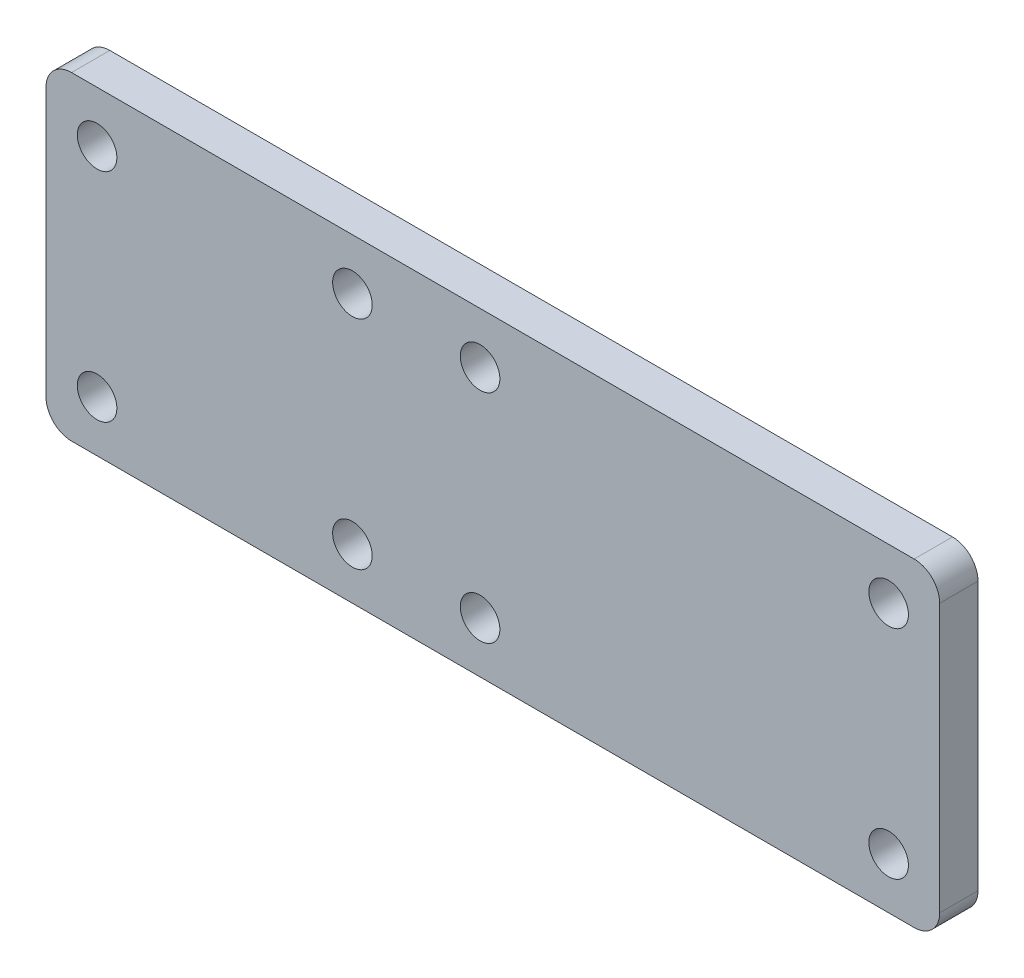
ISO-10303-21;
HEADER;
FILE_DESCRIPTION(('STEP AP214'),'2;1');
FILE_NAME('part.step','',(''),(''),'','','');
FILE_SCHEMA(('AUTOMOTIVE_DESIGN { 1 0 10303 214 1 1 1 1 }'));
ENDSEC;
DATA;
#1=APPLICATION_CONTEXT('core data for automotive mechanical design processes');
#2=APPLICATION_PROTOCOL_DEFINITION('international standard','automotive_design',2000,#1);
#3=PRODUCT_CONTEXT('',#1,'mechanical');
#4=PRODUCT('Part','Part','',(#3));
#5=PRODUCT_RELATED_PRODUCT_CATEGORY('part','',(#4));
#6=PRODUCT_DEFINITION_FORMATION('','',#4);
#7=PRODUCT_DEFINITION_CONTEXT('part definition',#1,'design');
#8=PRODUCT_DEFINITION('design','',#6,#7);
#9=PRODUCT_DEFINITION_SHAPE('','',#8);
#10=(LENGTH_UNIT() NAMED_UNIT(*) SI_UNIT(.MILLI.,.METRE.));
#11=(NAMED_UNIT(*) PLANE_ANGLE_UNIT() SI_UNIT($,.RADIAN.));
#12=(NAMED_UNIT(*) SI_UNIT($,.STERADIAN.) SOLID_ANGLE_UNIT());
#13=UNCERTAINTY_MEASURE_WITH_UNIT(LENGTH_MEASURE(1.E-05),#10,'distance_accuracy_value','');
#14=(GEOMETRIC_REPRESENTATION_CONTEXT(3) GLOBAL_UNCERTAINTY_ASSIGNED_CONTEXT((#13)) GLOBAL_UNIT_ASSIGNED_CONTEXT((#10,
#11,#12)) REPRESENTATION_CONTEXT('',''));
#15=CARTESIAN_POINT('',(0.,0.,0.));
#16=DIRECTION('',(0.,0.,1.));
#17=DIRECTION('',(1.,0.,0.));
#18=AXIS2_PLACEMENT_3D('',#15,#16,#17);
#19=CARTESIAN_POINT('',(35.,-12.5,3.));
#20=DIRECTION('',(-1.,0.,0.));
#21=DIRECTION('',(0.,0.,1.));
#22=AXIS2_PLACEMENT_3D('',#19,#20,#21);
#23=PLANE('',#22);
#24=DIRECTION('',(0.,1.,0.));
#25=VECTOR('',#24,1.);
#26=CARTESIAN_POINT('',(35.,-12.5,3.));
#27=LINE('',#26,#25);
#28=CARTESIAN_POINT('',(35.,-10.5,3.));
#29=VERTEX_POINT('',#28);
#30=CARTESIAN_POINT('',(35.,10.5,3.));
#31=VERTEX_POINT('',#30);
#32=EDGE_CURVE('E120',#29,#31,#27,.T.);
#33=ORIENTED_EDGE('',*,*,#32,.F.);
#34=DIRECTION('',(0.,0.,-1.));
#35=VECTOR('',#34,1.);
#36=CARTESIAN_POINT('',(35.,-10.5,3.));
#37=LINE('',#36,#35);
#38=CARTESIAN_POINT('',(35.,-10.5,0.));
#39=VERTEX_POINT('',#38);
#40=EDGE_CURVE('E105',#29,#39,#37,.T.);
#41=ORIENTED_EDGE('',*,*,#40,.T.);
#42=DIRECTION('',(0.,1.,0.));
#43=VECTOR('',#42,1.);
#44=CARTESIAN_POINT('',(35.,-12.5,0.));
#45=LINE('',#44,#43);
#46=CARTESIAN_POINT('',(35.,10.5,0.));
#47=VERTEX_POINT('',#46);
#48=EDGE_CURVE('E117',#39,#47,#45,.T.);
#49=ORIENTED_EDGE('',*,*,#48,.T.);
#50=DIRECTION('',(0.,0.,-1.));
#51=VECTOR('',#50,1.);
#52=CARTESIAN_POINT('',(35.,10.5,3.));
#53=LINE('',#52,#51);
#54=EDGE_CURVE('E122',#47,#31,#53,.F.);
#55=ORIENTED_EDGE('',*,*,#54,.T.);
#56=EDGE_LOOP('',(#33,#41,#49,#55));
#57=FACE_BOUND('',#56,.T.);
#58=ADVANCED_FACE('F35',(#57),#23,.F.);
#59=CARTESIAN_POINT('',(-35.,12.5,3.));
#60=DIRECTION('',(0.,-1.,0.));
#61=DIRECTION('',(0.,0.,-1.));
#62=AXIS2_PLACEMENT_3D('',#59,#60,#61);
#63=PLANE('',#62);
#64=DIRECTION('',(-1.,0.,0.));
#65=VECTOR('',#64,1.);
#66=CARTESIAN_POINT('',(-35.,12.5,0.));
#67=LINE('',#66,#65);
#68=CARTESIAN_POINT('',(33.,12.5,0.));
#69=VERTEX_POINT('',#68);
#70=CARTESIAN_POINT('',(-33.,12.5,0.));
#71=VERTEX_POINT('',#70);
#72=EDGE_CURVE('E126',#69,#71,#67,.T.);
#73=ORIENTED_EDGE('',*,*,#72,.T.);
#74=DIRECTION('',(0.,0.,-1.));
#75=VECTOR('',#74,1.);
#76=CARTESIAN_POINT('',(-33.,12.5,3.));
#77=LINE('',#76,#75);
#78=CARTESIAN_POINT('',(-33.,12.5,3.));
#79=VERTEX_POINT('',#78);
#80=EDGE_CURVE('E11',#71,#79,#77,.F.);
#81=ORIENTED_EDGE('',*,*,#80,.T.);
#82=DIRECTION('',(-1.,0.,0.));
#83=VECTOR('',#82,1.);
#84=CARTESIAN_POINT('',(-35.,12.5,3.));
#85=LINE('',#84,#83);
#86=CARTESIAN_POINT('',(33.,12.5,3.));
#87=VERTEX_POINT('',#86);
#88=EDGE_CURVE('E166',#87,#79,#85,.T.);
#89=ORIENTED_EDGE('',*,*,#88,.F.);
#90=DIRECTION('',(0.,0.,-1.));
#91=VECTOR('',#90,1.);
#92=CARTESIAN_POINT('',(33.,12.5,3.));
#93=LINE('',#92,#91);
#94=EDGE_CURVE('E43',#87,#69,#93,.T.);
#95=ORIENTED_EDGE('',*,*,#94,.T.);
#96=EDGE_LOOP('',(#73,#81,#89,#95));
#97=FACE_BOUND('',#96,.T.);
#98=ADVANCED_FACE('F164',(#97),#63,.F.);
#99=CARTESIAN_POINT('',(-35.,-12.5,3.));
#100=DIRECTION('',(1.,0.,0.));
#101=DIRECTION('',(0.,0.,-1.));
#102=AXIS2_PLACEMENT_3D('',#99,#100,#101);
#103=PLANE('',#102);
#104=DIRECTION('',(0.,-1.,0.));
#105=VECTOR('',#104,1.);
#106=CARTESIAN_POINT('',(-35.,-12.5,0.));
#107=LINE('',#106,#105);
#108=CARTESIAN_POINT('',(-35.,10.5,0.));
#109=VERTEX_POINT('',#108);
#110=CARTESIAN_POINT('',(-35.,-10.5,0.));
#111=VERTEX_POINT('',#110);
#112=EDGE_CURVE('E130',#109,#111,#107,.T.);
#113=ORIENTED_EDGE('',*,*,#112,.T.);
#114=DIRECTION('',(0.,0.,-1.));
#115=VECTOR('',#114,1.);
#116=CARTESIAN_POINT('',(-35.,-10.5,3.));
#117=LINE('',#116,#115);
#118=CARTESIAN_POINT('',(-35.,-10.5,3.));
#119=VERTEX_POINT('',#118);
#120=EDGE_CURVE('E50',#111,#119,#117,.F.);
#121=ORIENTED_EDGE('',*,*,#120,.T.);
#122=DIRECTION('',(0.,-1.,0.));
#123=VECTOR('',#122,1.);
#124=CARTESIAN_POINT('',(-35.,-12.5,3.));
#125=LINE('',#124,#123);
#126=CARTESIAN_POINT('',(-35.,10.5,3.));
#127=VERTEX_POINT('',#126);
#128=EDGE_CURVE('E174',#127,#119,#125,.T.);
#129=ORIENTED_EDGE('',*,*,#128,.F.);
#130=DIRECTION('',(0.,0.,-1.));
#131=VECTOR('',#130,1.);
#132=CARTESIAN_POINT('',(-35.,10.5,3.));
#133=LINE('',#132,#131);
#134=EDGE_CURVE('E157',#127,#109,#133,.T.);
#135=ORIENTED_EDGE('',*,*,#134,.T.);
#136=EDGE_LOOP('',(#113,#121,#129,#135));
#137=FACE_BOUND('',#136,.T.);
#138=ADVANCED_FACE('F173',(#137),#103,.F.);
#139=CARTESIAN_POINT('',(-35.,-12.5,3.));
#140=DIRECTION('',(0.,1.,0.));
#141=DIRECTION('',(0.,0.,1.));
#142=AXIS2_PLACEMENT_3D('',#139,#140,#141);
#143=PLANE('',#142);
#144=DIRECTION('',(1.,0.,0.));
#145=VECTOR('',#144,1.);
#146=CARTESIAN_POINT('',(-35.,-12.5,0.));
#147=LINE('',#146,#145);
#148=CARTESIAN_POINT('',(-33.,-12.5,0.));
#149=VERTEX_POINT('',#148);
#150=CARTESIAN_POINT('',(33.,-12.5,0.));
#151=VERTEX_POINT('',#150);
#152=EDGE_CURVE('E140',#149,#151,#147,.T.);
#153=ORIENTED_EDGE('',*,*,#152,.T.);
#154=DIRECTION('',(0.,0.,-1.));
#155=VECTOR('',#154,1.);
#156=CARTESIAN_POINT('',(33.,-12.5,3.));
#157=LINE('',#156,#155);
#158=CARTESIAN_POINT('',(33.,-12.5,3.));
#159=VERTEX_POINT('',#158);
#160=EDGE_CURVE('E106',#151,#159,#157,.F.);
#161=ORIENTED_EDGE('',*,*,#160,.T.);
#162=DIRECTION('',(1.,0.,0.));
#163=VECTOR('',#162,1.);
#164=CARTESIAN_POINT('',(-35.,-12.5,3.));
#165=LINE('',#164,#163);
#166=CARTESIAN_POINT('',(-33.,-12.5,3.));
#167=VERTEX_POINT('',#166);
#168=EDGE_CURVE('E136',#167,#159,#165,.T.);
#169=ORIENTED_EDGE('',*,*,#168,.F.);
#170=DIRECTION('',(0.,0.,-1.));
#171=VECTOR('',#170,1.);
#172=CARTESIAN_POINT('',(-33.,-12.5,3.));
#173=LINE('',#172,#171);
#174=EDGE_CURVE('E111',#167,#149,#173,.T.);
#175=ORIENTED_EDGE('',*,*,#174,.T.);
#176=EDGE_LOOP('',(#153,#161,#169,#175));
#177=FACE_BOUND('',#176,.T.);
#178=ADVANCED_FACE('F238',(#177),#143,.F.);
#179=CARTESIAN_POINT('',(0.,0.,3.));
#180=DIRECTION('',(0.,0.,-1.));
#181=DIRECTION('',(-1.,0.,0.));
#182=AXIS2_PLACEMENT_3D('',#179,#180,#181);
#183=PLANE('',#182);
#184=CARTESIAN_POINT('',(-11.,-8.5,3.));
#185=DIRECTION('',(0.,0.,1.));
#186=DIRECTION('',(1.,0.,0.));
#187=AXIS2_PLACEMENT_3D('',#184,#185,#186);
#188=CIRCLE('',#187,1.55);
#189=CARTESIAN_POINT('',(-9.45000000000001,-8.5,3.));
#190=VERTEX_POINT('',#189);
#191=EDGE_CURVE('E195',#190,#190,#188,.T.);
#192=ORIENTED_EDGE('',*,*,#191,.F.);
#193=EDGE_LOOP('',(#192));
#194=FACE_BOUND('',#193,.T.);
#195=CARTESIAN_POINT('',(31.,-8.5,3.));
#196=DIRECTION('',(0.,0.,1.));
#197=DIRECTION('',(1.,0.,0.));
#198=AXIS2_PLACEMENT_3D('',#195,#196,#197);
#199=CIRCLE('',#198,1.55);
#200=CARTESIAN_POINT('',(32.55,-8.5,3.));
#201=VERTEX_POINT('',#200);
#202=EDGE_CURVE('E202',#201,#201,#199,.T.);
#203=ORIENTED_EDGE('',*,*,#202,.F.);
#204=EDGE_LOOP('',(#203));
#205=FACE_BOUND('',#204,.T.);
#206=CARTESIAN_POINT('',(-1.,-8.5,3.));
#207=DIRECTION('',(0.,0.,1.));
#208=DIRECTION('',(1.,0.,0.));
#209=AXIS2_PLACEMENT_3D('',#206,#207,#208);
#210=CIRCLE('',#209,1.55);
#211=CARTESIAN_POINT('',(0.55,-8.5,3.));
#212=VERTEX_POINT('',#211);
#213=EDGE_CURVE('E183',#212,#212,#210,.T.);
#214=ORIENTED_EDGE('',*,*,#213,.F.);
#215=EDGE_LOOP('',(#214));
#216=FACE_BOUND('',#215,.T.);
#217=CARTESIAN_POINT('',(-1.,8.5,3.));
#218=DIRECTION('',(0.,0.,1.));
#219=DIRECTION('',(1.,0.,0.));
#220=AXIS2_PLACEMENT_3D('',#217,#218,#219);
#221=CIRCLE('',#220,1.55);
#222=CARTESIAN_POINT('',(0.55,8.5,3.));
#223=VERTEX_POINT('',#222);
#224=EDGE_CURVE('E190',#223,#223,#221,.T.);
#225=ORIENTED_EDGE('',*,*,#224,.F.);
#226=EDGE_LOOP('',(#225));
#227=FACE_BOUND('',#226,.T.);
#228=CARTESIAN_POINT('',(-31.,-8.5,3.));
#229=DIRECTION('',(0.,0.,1.));
#230=DIRECTION('',(1.,0.,0.));
#231=AXIS2_PLACEMENT_3D('',#228,#229,#230);
#232=CIRCLE('',#231,1.55);
#233=CARTESIAN_POINT('',(-29.45,-8.5,3.));
#234=VERTEX_POINT('',#233);
#235=EDGE_CURVE('E219',#234,#234,#232,.T.);
#236=ORIENTED_EDGE('',*,*,#235,.F.);
#237=EDGE_LOOP('',(#236));
#238=FACE_BOUND('',#237,.T.);
#239=CARTESIAN_POINT('',(-31.,8.5,3.));
#240=DIRECTION('',(0.,0.,1.));
#241=DIRECTION('',(1.,0.,0.));
#242=AXIS2_PLACEMENT_3D('',#239,#240,#241);
#243=CIRCLE('',#242,1.55);
#244=CARTESIAN_POINT('',(-29.45,8.5,3.));
#245=VERTEX_POINT('',#244);
#246=EDGE_CURVE('E213',#245,#245,#243,.T.);
#247=ORIENTED_EDGE('',*,*,#246,.F.);
#248=EDGE_LOOP('',(#247));
#249=FACE_BOUND('',#248,.T.);
#250=CARTESIAN_POINT('',(-11.,8.5,3.));
#251=DIRECTION('',(0.,0.,1.));
#252=DIRECTION('',(1.,0.,0.));
#253=AXIS2_PLACEMENT_3D('',#250,#251,#252);
#254=CIRCLE('',#253,1.55);
#255=CARTESIAN_POINT('',(-9.45000000000001,8.5,3.));
#256=VERTEX_POINT('',#255);
#257=EDGE_CURVE('E207',#256,#256,#254,.T.);
#258=ORIENTED_EDGE('',*,*,#257,.F.);
#259=EDGE_LOOP('',(#258));
#260=FACE_BOUND('',#259,.T.);
#261=CARTESIAN_POINT('',(31.,8.5,3.));
#262=DIRECTION('',(0.,0.,1.));
#263=DIRECTION('',(1.,0.,0.));
#264=AXIS2_PLACEMENT_3D('',#261,#262,#263);
#265=CIRCLE('',#264,1.55);
#266=CARTESIAN_POINT('',(32.55,8.5,3.));
#267=VERTEX_POINT('',#266);
#268=EDGE_CURVE('E133',#267,#267,#265,.T.);
#269=ORIENTED_EDGE('',*,*,#268,.F.);
#270=EDGE_LOOP('',(#269));
#271=FACE_BOUND('',#270,.T.);
#272=ORIENTED_EDGE('',*,*,#168,.T.);
#273=CARTESIAN_POINT('',(33.,-10.5,3.));
#274=DIRECTION('',(0.,0.,-1.));
#275=DIRECTION('',(-1.,0.,0.));
#276=AXIS2_PLACEMENT_3D('',#273,#274,#275);
#277=CIRCLE('',#276,2.);
#278=EDGE_CURVE('E155',#159,#29,#277,.F.);
#279=ORIENTED_EDGE('',*,*,#278,.T.);
#280=ORIENTED_EDGE('',*,*,#32,.T.);
#281=CARTESIAN_POINT('',(33.,10.5,3.));
#282=DIRECTION('',(0.,0.,-1.));
#283=DIRECTION('',(-1.,0.,0.));
#284=AXIS2_PLACEMENT_3D('',#281,#282,#283);
#285=CIRCLE('',#284,2.);
#286=EDGE_CURVE('E150',#31,#87,#285,.F.);
#287=ORIENTED_EDGE('',*,*,#286,.T.);
#288=ORIENTED_EDGE('',*,*,#88,.T.);
#289=CARTESIAN_POINT('',(-33.,10.5,3.));
#290=DIRECTION('',(0.,0.,-1.));
#291=DIRECTION('',(-1.,0.,0.));
#292=AXIS2_PLACEMENT_3D('',#289,#290,#291);
#293=CIRCLE('',#292,2.);
#294=EDGE_CURVE('E57',#79,#127,#293,.F.);
#295=ORIENTED_EDGE('',*,*,#294,.T.);
#296=ORIENTED_EDGE('',*,*,#128,.T.);
#297=CARTESIAN_POINT('',(-33.,-10.5,3.));
#298=DIRECTION('',(0.,0.,-1.));
#299=DIRECTION('',(-1.,0.,0.));
#300=AXIS2_PLACEMENT_3D('',#297,#298,#299);
#301=CIRCLE('',#300,2.);
#302=EDGE_CURVE('E153',#119,#167,#301,.F.);
#303=ORIENTED_EDGE('',*,*,#302,.T.);
#304=EDGE_LOOP('',(#272,#279,#280,#287,#288,#295,#296,#303));
#305=FACE_BOUND('',#304,.T.);
#306=ADVANCED_FACE('F235',(#194,#205,#216,#227,#238,#249,#260,#271,#305),#183,.F.);
#307=CARTESIAN_POINT('',(0.,0.,0.));
#308=DIRECTION('',(0.,0.,-1.));
#309=DIRECTION('',(-1.,0.,0.));
#310=AXIS2_PLACEMENT_3D('',#307,#308,#309);
#311=PLANE('',#310);
#312=CARTESIAN_POINT('',(-11.,-8.5,0.));
#313=DIRECTION('',(0.,0.,1.));
#314=DIRECTION('',(1.,0.,0.));
#315=AXIS2_PLACEMENT_3D('',#312,#313,#314);
#316=CIRCLE('',#315,1.55);
#317=CARTESIAN_POINT('',(-9.45000000000001,-8.5,0.));
#318=VERTEX_POINT('',#317);
#319=EDGE_CURVE('E198',#318,#318,#316,.T.);
#320=ORIENTED_EDGE('',*,*,#319,.T.);
#321=EDGE_LOOP('',(#320));
#322=FACE_BOUND('',#321,.T.);
#323=CARTESIAN_POINT('',(31.,-8.5,0.));
#324=DIRECTION('',(0.,0.,1.));
#325=DIRECTION('',(1.,0.,0.));
#326=AXIS2_PLACEMENT_3D('',#323,#324,#325);
#327=CIRCLE('',#326,1.55);
#328=CARTESIAN_POINT('',(32.55,-8.5,0.));
#329=VERTEX_POINT('',#328);
#330=EDGE_CURVE('E187',#329,#329,#327,.T.);
#331=ORIENTED_EDGE('',*,*,#330,.T.);
#332=EDGE_LOOP('',(#331));
#333=FACE_BOUND('',#332,.T.);
#334=CARTESIAN_POINT('',(-1.,-8.5,0.));
#335=DIRECTION('',(0.,0.,1.));
#336=DIRECTION('',(1.,0.,0.));
#337=AXIS2_PLACEMENT_3D('',#334,#335,#336);
#338=CIRCLE('',#337,1.55);
#339=CARTESIAN_POINT('',(0.55,-8.5,0.));
#340=VERTEX_POINT('',#339);
#341=EDGE_CURVE('E186',#340,#340,#338,.T.);
#342=ORIENTED_EDGE('',*,*,#341,.T.);
#343=EDGE_LOOP('',(#342));
#344=FACE_BOUND('',#343,.T.);
#345=CARTESIAN_POINT('',(-1.,8.5,0.));
#346=DIRECTION('',(0.,0.,1.));
#347=DIRECTION('',(1.,0.,0.));
#348=AXIS2_PLACEMENT_3D('',#345,#346,#347);
#349=CIRCLE('',#348,1.55);
#350=CARTESIAN_POINT('',(0.55,8.5,0.));
#351=VERTEX_POINT('',#350);
#352=EDGE_CURVE('E181',#351,#351,#349,.T.);
#353=ORIENTED_EDGE('',*,*,#352,.T.);
#354=EDGE_LOOP('',(#353));
#355=FACE_BOUND('',#354,.T.);
#356=CARTESIAN_POINT('',(-31.,-8.5,0.));
#357=DIRECTION('',(0.,0.,1.));
#358=DIRECTION('',(1.,0.,0.));
#359=AXIS2_PLACEMENT_3D('',#356,#357,#358);
#360=CIRCLE('',#359,1.55);
#361=CARTESIAN_POINT('',(-29.45,-8.5,0.));
#362=VERTEX_POINT('',#361);
#363=EDGE_CURVE('E199',#362,#362,#360,.T.);
#364=ORIENTED_EDGE('',*,*,#363,.T.);
#365=EDGE_LOOP('',(#364));
#366=FACE_BOUND('',#365,.T.);
#367=CARTESIAN_POINT('',(-31.,8.5,0.));
#368=DIRECTION('',(0.,0.,1.));
#369=DIRECTION('',(1.,0.,0.));
#370=AXIS2_PLACEMENT_3D('',#367,#368,#369);
#371=CIRCLE('',#370,1.55);
#372=CARTESIAN_POINT('',(-29.45,8.5,0.));
#373=VERTEX_POINT('',#372);
#374=EDGE_CURVE('E216',#373,#373,#371,.T.);
#375=ORIENTED_EDGE('',*,*,#374,.T.);
#376=EDGE_LOOP('',(#375));
#377=FACE_BOUND('',#376,.T.);
#378=CARTESIAN_POINT('',(-11.,8.5,0.));
#379=DIRECTION('',(0.,0.,1.));
#380=DIRECTION('',(1.,0.,0.));
#381=AXIS2_PLACEMENT_3D('',#378,#379,#380);
#382=CIRCLE('',#381,1.55);
#383=CARTESIAN_POINT('',(-9.45000000000001,8.5,0.));
#384=VERTEX_POINT('',#383);
#385=EDGE_CURVE('E210',#384,#384,#382,.T.);
#386=ORIENTED_EDGE('',*,*,#385,.T.);
#387=EDGE_LOOP('',(#386));
#388=FACE_BOUND('',#387,.T.);
#389=CARTESIAN_POINT('',(31.,8.5,0.));
#390=DIRECTION('',(0.,0.,1.));
#391=DIRECTION('',(1.,0.,0.));
#392=AXIS2_PLACEMENT_3D('',#389,#390,#391);
#393=CIRCLE('',#392,1.55);
#394=CARTESIAN_POINT('',(32.55,8.5,0.));
#395=VERTEX_POINT('',#394);
#396=EDGE_CURVE('E127',#395,#395,#393,.T.);
#397=ORIENTED_EDGE('',*,*,#396,.T.);
#398=EDGE_LOOP('',(#397));
#399=FACE_BOUND('',#398,.T.);
#400=ORIENTED_EDGE('',*,*,#48,.F.);
#401=CARTESIAN_POINT('',(33.,-10.5,0.));
#402=DIRECTION('',(0.,0.,-1.));
#403=DIRECTION('',(-1.,0.,0.));
#404=AXIS2_PLACEMENT_3D('',#401,#402,#403);
#405=CIRCLE('',#404,2.);
#406=EDGE_CURVE('E101',#39,#151,#405,.T.);
#407=ORIENTED_EDGE('',*,*,#406,.T.);
#408=ORIENTED_EDGE('',*,*,#152,.F.);
#409=CARTESIAN_POINT('',(-33.,-10.5,0.));
#410=DIRECTION('',(0.,0.,-1.));
#411=DIRECTION('',(-1.,0.,0.));
#412=AXIS2_PLACEMENT_3D('',#409,#410,#411);
#413=CIRCLE('',#412,2.);
#414=EDGE_CURVE('E112',#149,#111,#413,.T.);
#415=ORIENTED_EDGE('',*,*,#414,.T.);
#416=ORIENTED_EDGE('',*,*,#112,.F.);
#417=CARTESIAN_POINT('',(-33.,10.5,0.));
#418=DIRECTION('',(0.,0.,-1.));
#419=DIRECTION('',(-1.,0.,0.));
#420=AXIS2_PLACEMENT_3D('',#417,#418,#419);
#421=CIRCLE('',#420,2.);
#422=EDGE_CURVE('E144',#109,#71,#421,.T.);
#423=ORIENTED_EDGE('',*,*,#422,.T.);
#424=ORIENTED_EDGE('',*,*,#72,.F.);
#425=CARTESIAN_POINT('',(33.,10.5,0.));
#426=DIRECTION('',(0.,0.,-1.));
#427=DIRECTION('',(-1.,0.,0.));
#428=AXIS2_PLACEMENT_3D('',#425,#426,#427);
#429=CIRCLE('',#428,2.);
#430=EDGE_CURVE('E121',#69,#47,#429,.T.);
#431=ORIENTED_EDGE('',*,*,#430,.T.);
#432=EDGE_LOOP('',(#400,#407,#408,#415,#416,#423,#424,#431));
#433=FACE_BOUND('',#432,.T.);
#434=ADVANCED_FACE('F124',(#322,#333,#344,#355,#366,#377,#388,#399,#433),#311,.T.);
#435=CARTESIAN_POINT('',(31.,8.5,0.));
#436=DIRECTION('',(0.,0.,1.));
#437=DIRECTION('',(1.,0.,0.));
#438=AXIS2_PLACEMENT_3D('',#435,#436,#437);
#439=CYLINDRICAL_SURFACE('',#438,1.55);
#440=ORIENTED_EDGE('',*,*,#396,.F.);
#441=EDGE_LOOP('',(#440));
#442=FACE_BOUND('',#441,.T.);
#443=ORIENTED_EDGE('',*,*,#268,.T.);
#444=EDGE_LOOP('',(#443));
#445=FACE_BOUND('',#444,.T.);
#446=ADVANCED_FACE('F272',(#442,#445),#439,.F.);
#447=CARTESIAN_POINT('',(-11.,8.5,0.));
#448=DIRECTION('',(0.,0.,1.));
#449=DIRECTION('',(1.,0.,0.));
#450=AXIS2_PLACEMENT_3D('',#447,#448,#449);
#451=CYLINDRICAL_SURFACE('',#450,1.55);
#452=ORIENTED_EDGE('',*,*,#385,.F.);
#453=EDGE_LOOP('',(#452));
#454=FACE_BOUND('',#453,.T.);
#455=ORIENTED_EDGE('',*,*,#257,.T.);
#456=EDGE_LOOP('',(#455));
#457=FACE_BOUND('',#456,.T.);
#458=ADVANCED_FACE('F277',(#454,#457),#451,.F.);
#459=CARTESIAN_POINT('',(-31.,8.5,0.));
#460=DIRECTION('',(0.,0.,1.));
#461=DIRECTION('',(1.,0.,0.));
#462=AXIS2_PLACEMENT_3D('',#459,#460,#461);
#463=CYLINDRICAL_SURFACE('',#462,1.55);
#464=ORIENTED_EDGE('',*,*,#374,.F.);
#465=EDGE_LOOP('',(#464));
#466=FACE_BOUND('',#465,.T.);
#467=ORIENTED_EDGE('',*,*,#246,.T.);
#468=EDGE_LOOP('',(#467));
#469=FACE_BOUND('',#468,.T.);
#470=ADVANCED_FACE('F231',(#466,#469),#463,.F.);
#471=CARTESIAN_POINT('',(-31.,-8.5,0.));
#472=DIRECTION('',(0.,0.,1.));
#473=DIRECTION('',(1.,0.,0.));
#474=AXIS2_PLACEMENT_3D('',#471,#472,#473);
#475=CYLINDRICAL_SURFACE('',#474,1.55);
#476=ORIENTED_EDGE('',*,*,#363,.F.);
#477=EDGE_LOOP('',(#476));
#478=FACE_BOUND('',#477,.T.);
#479=ORIENTED_EDGE('',*,*,#235,.T.);
#480=EDGE_LOOP('',(#479));
#481=FACE_BOUND('',#480,.T.);
#482=ADVANCED_FACE('F227',(#478,#481),#475,.F.);
#483=CARTESIAN_POINT('',(-1.,8.5,0.));
#484=DIRECTION('',(0.,0.,1.));
#485=DIRECTION('',(1.,0.,0.));
#486=AXIS2_PLACEMENT_3D('',#483,#484,#485);
#487=CYLINDRICAL_SURFACE('',#486,1.55);
#488=ORIENTED_EDGE('',*,*,#352,.F.);
#489=EDGE_LOOP('',(#488));
#490=FACE_BOUND('',#489,.T.);
#491=ORIENTED_EDGE('',*,*,#224,.T.);
#492=EDGE_LOOP('',(#491));
#493=FACE_BOUND('',#492,.T.);
#494=ADVANCED_FACE('F230',(#490,#493),#487,.F.);
#495=CARTESIAN_POINT('',(-1.,-8.5,0.));
#496=DIRECTION('',(0.,0.,1.));
#497=DIRECTION('',(1.,0.,0.));
#498=AXIS2_PLACEMENT_3D('',#495,#496,#497);
#499=CYLINDRICAL_SURFACE('',#498,1.55);
#500=ORIENTED_EDGE('',*,*,#341,.F.);
#501=EDGE_LOOP('',(#500));
#502=FACE_BOUND('',#501,.T.);
#503=ORIENTED_EDGE('',*,*,#213,.T.);
#504=EDGE_LOOP('',(#503));
#505=FACE_BOUND('',#504,.T.);
#506=ADVANCED_FACE('F279',(#502,#505),#499,.F.);
#507=CARTESIAN_POINT('',(31.,-8.5,0.));
#508=DIRECTION('',(0.,0.,1.));
#509=DIRECTION('',(1.,0.,0.));
#510=AXIS2_PLACEMENT_3D('',#507,#508,#509);
#511=CYLINDRICAL_SURFACE('',#510,1.55);
#512=ORIENTED_EDGE('',*,*,#330,.F.);
#513=EDGE_LOOP('',(#512));
#514=FACE_BOUND('',#513,.T.);
#515=ORIENTED_EDGE('',*,*,#202,.T.);
#516=EDGE_LOOP('',(#515));
#517=FACE_BOUND('',#516,.T.);
#518=ADVANCED_FACE('F282',(#514,#517),#511,.F.);
#519=CARTESIAN_POINT('',(-11.,-8.5,0.));
#520=DIRECTION('',(0.,0.,1.));
#521=DIRECTION('',(1.,0.,0.));
#522=AXIS2_PLACEMENT_3D('',#519,#520,#521);
#523=CYLINDRICAL_SURFACE('',#522,1.55);
#524=ORIENTED_EDGE('',*,*,#319,.F.);
#525=EDGE_LOOP('',(#524));
#526=FACE_BOUND('',#525,.T.);
#527=ORIENTED_EDGE('',*,*,#191,.T.);
#528=EDGE_LOOP('',(#527));
#529=FACE_BOUND('',#528,.T.);
#530=ADVANCED_FACE('F257',(#526,#529),#523,.F.);
#531=CARTESIAN_POINT('',(33.,-10.5,3.));
#532=DIRECTION('',(0.,0.,-1.));
#533=DIRECTION('',(-1.,0.,0.));
#534=AXIS2_PLACEMENT_3D('',#531,#532,#533);
#535=CYLINDRICAL_SURFACE('',#534,2.);
#536=ORIENTED_EDGE('',*,*,#278,.F.);
#537=ORIENTED_EDGE('',*,*,#160,.F.);
#538=ORIENTED_EDGE('',*,*,#406,.F.);
#539=ORIENTED_EDGE('',*,*,#40,.F.);
#540=EDGE_LOOP('',(#536,#537,#538,#539));
#541=FACE_BOUND('',#540,.T.);
#542=ADVANCED_FACE('F104',(#541),#535,.T.);
#543=CARTESIAN_POINT('',(-33.,-10.5,3.));
#544=DIRECTION('',(0.,0.,-1.));
#545=DIRECTION('',(-1.,0.,0.));
#546=AXIS2_PLACEMENT_3D('',#543,#544,#545);
#547=CYLINDRICAL_SURFACE('',#546,2.);
#548=ORIENTED_EDGE('',*,*,#302,.F.);
#549=ORIENTED_EDGE('',*,*,#120,.F.);
#550=ORIENTED_EDGE('',*,*,#414,.F.);
#551=ORIENTED_EDGE('',*,*,#174,.F.);
#552=EDGE_LOOP('',(#548,#549,#550,#551));
#553=FACE_BOUND('',#552,.T.);
#554=ADVANCED_FACE('F250',(#553),#547,.T.);
#555=CARTESIAN_POINT('',(-33.,10.5,3.));
#556=DIRECTION('',(0.,0.,-1.));
#557=DIRECTION('',(-1.,0.,0.));
#558=AXIS2_PLACEMENT_3D('',#555,#556,#557);
#559=CYLINDRICAL_SURFACE('',#558,2.);
#560=ORIENTED_EDGE('',*,*,#294,.F.);
#561=ORIENTED_EDGE('',*,*,#80,.F.);
#562=ORIENTED_EDGE('',*,*,#422,.F.);
#563=ORIENTED_EDGE('',*,*,#134,.F.);
#564=EDGE_LOOP('',(#560,#561,#562,#563));
#565=FACE_BOUND('',#564,.T.);
#566=ADVANCED_FACE('F172',(#565),#559,.T.);
#567=CARTESIAN_POINT('',(33.,10.5,3.));
#568=DIRECTION('',(0.,0.,-1.));
#569=DIRECTION('',(-1.,0.,0.));
#570=AXIS2_PLACEMENT_3D('',#567,#568,#569);
#571=CYLINDRICAL_SURFACE('',#570,2.);
#572=ORIENTED_EDGE('',*,*,#286,.F.);
#573=ORIENTED_EDGE('',*,*,#54,.F.);
#574=ORIENTED_EDGE('',*,*,#430,.F.);
#575=ORIENTED_EDGE('',*,*,#94,.F.);
#576=EDGE_LOOP('',(#572,#573,#574,#575));
#577=FACE_BOUND('',#576,.T.);
#578=ADVANCED_FACE('F37',(#577),#571,.T.);
#579=CLOSED_SHELL('',(#58,#98,#138,#178,#306,#434,#446,#458,#470,#482,#494,#506,#518,#530,#542,
#554,#566,#578));
#580=MANIFOLD_SOLID_BREP('B2',#579);
#581=ADVANCED_BREP_SHAPE_REPRESENTATION('',(#18,#580),#14);
#582=SHAPE_DEFINITION_REPRESENTATION(#9,#581);
ENDSEC;
END-ISO-10303-21;
